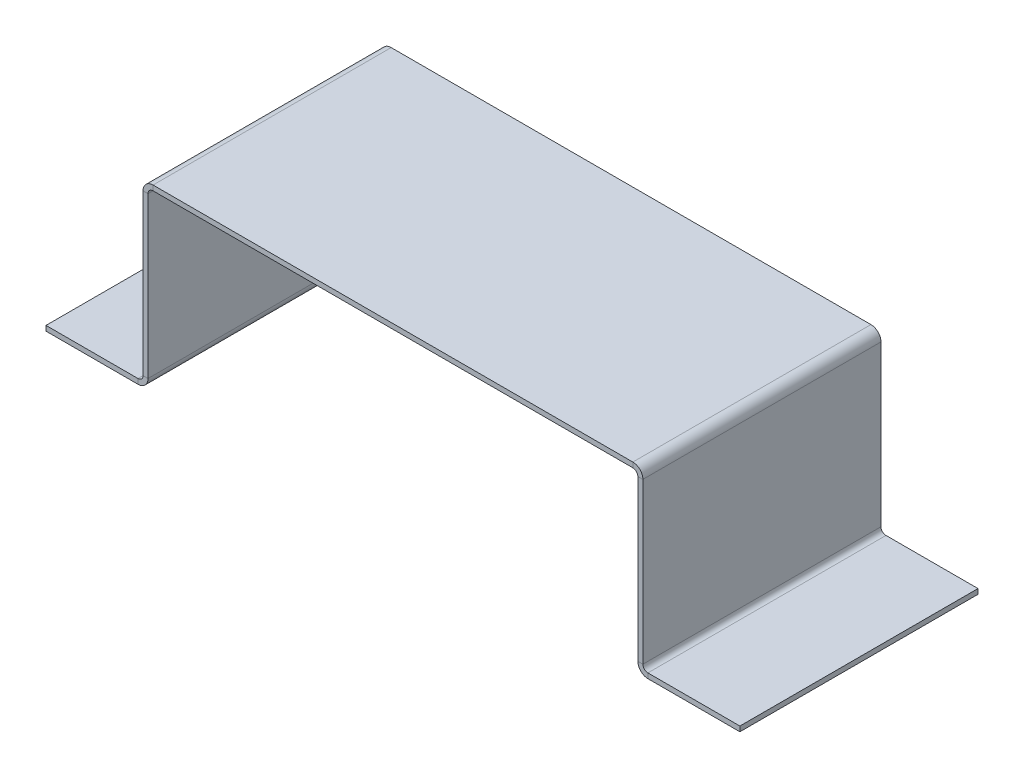
ISO-10303-21;
HEADER;
FILE_DESCRIPTION(('STEP AP214'),'2;1');
FILE_NAME('part.step','',(''),(''),'','','');
FILE_SCHEMA(('AUTOMOTIVE_DESIGN { 1 0 10303 214 1 1 1 1 }'));
ENDSEC;
DATA;
#1=APPLICATION_CONTEXT('core data for automotive mechanical design processes');
#2=APPLICATION_PROTOCOL_DEFINITION('international standard','automotive_design',2000,#1);
#3=PRODUCT_CONTEXT('',#1,'mechanical');
#4=PRODUCT('Part','Part','',(#3));
#5=PRODUCT_RELATED_PRODUCT_CATEGORY('part','',(#4));
#6=PRODUCT_DEFINITION_FORMATION('','',#4);
#7=PRODUCT_DEFINITION_CONTEXT('part definition',#1,'design');
#8=PRODUCT_DEFINITION('design','',#6,#7);
#9=PRODUCT_DEFINITION_SHAPE('','',#8);
#10=(LENGTH_UNIT() NAMED_UNIT(*) SI_UNIT(.MILLI.,.METRE.));
#11=(NAMED_UNIT(*) PLANE_ANGLE_UNIT() SI_UNIT($,.RADIAN.));
#12=(NAMED_UNIT(*) SI_UNIT($,.STERADIAN.) SOLID_ANGLE_UNIT());
#13=UNCERTAINTY_MEASURE_WITH_UNIT(LENGTH_MEASURE(1.E-05),#10,'distance_accuracy_value','');
#14=(GEOMETRIC_REPRESENTATION_CONTEXT(3) GLOBAL_UNCERTAINTY_ASSIGNED_CONTEXT((#13)) GLOBAL_UNIT_ASSIGNED_CONTEXT((#10,
#11,#12)) REPRESENTATION_CONTEXT('',''));
#15=CARTESIAN_POINT('',(0.,0.,0.));
#16=DIRECTION('',(0.,0.,1.));
#17=DIRECTION('',(1.,0.,0.));
#18=AXIS2_PLACEMENT_3D('',#15,#16,#17);
#19=CARTESIAN_POINT('',(36.7366000000001,-25.7366,17.5));
#20=DIRECTION('',(0.,0.,-1.));
#21=DIRECTION('',(-1.,0.,0.));
#22=AXIS2_PLACEMENT_3D('',#19,#20,#21);
#23=PLANE('',#22);
#24=DIRECTION('',(-1.,0.,0.));
#25=VECTOR('',#24,1.);
#26=CARTESIAN_POINT('',(36.7366000000001,-25.,17.5));
#27=LINE('',#26,#25);
#28=CARTESIAN_POINT('',(36.7366000000001,-25.,17.5));
#29=VERTEX_POINT('',#28);
#30=CARTESIAN_POINT('',(36.0000000000001,-25.,17.5));
#31=VERTEX_POINT('',#30);
#32=EDGE_CURVE('E231',#29,#31,#27,.T.);
#33=ORIENTED_EDGE('',*,*,#32,.F.);
#34=DIRECTION('',(0.,-1.,0.));
#35=VECTOR('',#34,1.);
#36=CARTESIAN_POINT('',(36.7366000000001,-25.7366,17.5));
#37=LINE('',#36,#35);
#38=CARTESIAN_POINT('',(36.7366,-1.47319999999999,17.5));
#39=VERTEX_POINT('',#38);
#40=EDGE_CURVE('E340',#39,#29,#37,.T.);
#41=ORIENTED_EDGE('',*,*,#40,.F.);
#42=DIRECTION('',(1.,0.,0.));
#43=VECTOR('',#42,1.);
#44=CARTESIAN_POINT('',(36.,-1.47319999999999,17.5));
#45=LINE('',#44,#43);
#46=CARTESIAN_POINT('',(36.,-1.47319999999999,17.5));
#47=VERTEX_POINT('',#46);
#48=EDGE_CURVE('E331',#47,#39,#45,.T.);
#49=ORIENTED_EDGE('',*,*,#48,.F.);
#50=DIRECTION('',(0.,-1.,0.));
#51=VECTOR('',#50,1.);
#52=CARTESIAN_POINT('',(36.0000000000001,-25.7366,17.5));
#53=LINE('',#52,#51);
#54=EDGE_CURVE('E339',#47,#31,#53,.T.);
#55=ORIENTED_EDGE('',*,*,#54,.T.);
#56=EDGE_LOOP('',(#33,#41,#49,#55));
#57=FACE_BOUND('',#56,.T.);
#58=ADVANCED_FACE('F37',(#57),#23,.F.);
#59=CARTESIAN_POINT('',(36.7366,-0.736599999999997,-17.5));
#60=DIRECTION('',(0.,0.,1.));
#61=DIRECTION('',(1.,0.,0.));
#62=AXIS2_PLACEMENT_3D('',#59,#60,#61);
#63=PLANE('',#62);
#64=DIRECTION('',(-1.,0.,0.));
#65=VECTOR('',#64,1.);
#66=CARTESIAN_POINT('',(36.7366000000001,-25.,-17.5));
#67=LINE('',#66,#65);
#68=CARTESIAN_POINT('',(36.7366000000001,-25.,-17.5));
#69=VERTEX_POINT('',#68);
#70=CARTESIAN_POINT('',(36.0000000000001,-25.,-17.5));
#71=VERTEX_POINT('',#70);
#72=EDGE_CURVE('E224',#69,#71,#67,.T.);
#73=ORIENTED_EDGE('',*,*,#72,.T.);
#74=DIRECTION('',(0.,1.,0.));
#75=VECTOR('',#74,1.);
#76=CARTESIAN_POINT('',(36.,-0.7366,-17.5));
#77=LINE('',#76,#75);
#78=CARTESIAN_POINT('',(36.,-1.47319999999999,-17.5));
#79=VERTEX_POINT('',#78);
#80=EDGE_CURVE('E344',#71,#79,#77,.T.);
#81=ORIENTED_EDGE('',*,*,#80,.T.);
#82=DIRECTION('',(1.,0.,0.));
#83=VECTOR('',#82,1.);
#84=CARTESIAN_POINT('',(36.,-1.47319999999999,-17.5));
#85=LINE('',#84,#83);
#86=CARTESIAN_POINT('',(36.7366,-1.47319999999999,-17.5));
#87=VERTEX_POINT('',#86);
#88=EDGE_CURVE('E326',#79,#87,#85,.T.);
#89=ORIENTED_EDGE('',*,*,#88,.T.);
#90=DIRECTION('',(0.,1.,0.));
#91=VECTOR('',#90,1.);
#92=CARTESIAN_POINT('',(36.7366,-0.736599999999997,-17.5));
#93=LINE('',#92,#91);
#94=EDGE_CURVE('E343',#69,#87,#93,.T.);
#95=ORIENTED_EDGE('',*,*,#94,.F.);
#96=EDGE_LOOP('',(#73,#81,#89,#95));
#97=FACE_BOUND('',#96,.T.);
#98=ADVANCED_FACE('F408',(#97),#63,.F.);
#99=CARTESIAN_POINT('',(36.7366,1.32467919035335E-13,0.));
#100=DIRECTION('',(-1.,0.,0.));
#101=DIRECTION('',(0.,-1.,0.));
#102=AXIS2_PLACEMENT_3D('',#99,#100,#101);
#103=PLANE('',#102);
#104=DIRECTION('',(0.,0.,-1.));
#105=VECTOR('',#104,1.);
#106=CARTESIAN_POINT('',(36.7366000000001,-25.,-17.5));
#107=LINE('',#106,#105);
#108=EDGE_CURVE('E228',#69,#29,#107,.F.);
#109=ORIENTED_EDGE('',*,*,#108,.F.);
#110=ORIENTED_EDGE('',*,*,#94,.T.);
#111=DIRECTION('',(0.,0.,-1.));
#112=VECTOR('',#111,1.);
#113=CARTESIAN_POINT('',(36.7366,-1.47319999999999,0.));
#114=LINE('',#113,#112);
#115=EDGE_CURVE('E334',#39,#87,#114,.T.);
#116=ORIENTED_EDGE('',*,*,#115,.F.);
#117=ORIENTED_EDGE('',*,*,#40,.T.);
#118=EDGE_LOOP('',(#109,#110,#116,#117));
#119=FACE_BOUND('',#118,.T.);
#120=ADVANCED_FACE('F395',(#119),#103,.F.);
#121=CARTESIAN_POINT('',(36.,1.29896093881143E-13,0.));
#122=DIRECTION('',(-1.,0.,0.));
#123=DIRECTION('',(0.,-1.,0.));
#124=AXIS2_PLACEMENT_3D('',#121,#122,#123);
#125=PLANE('',#124);
#126=ORIENTED_EDGE('',*,*,#80,.F.);
#127=DIRECTION('',(0.,0.,-1.));
#128=VECTOR('',#127,1.);
#129=CARTESIAN_POINT('',(36.0000000000001,-25.,-17.5));
#130=LINE('',#129,#128);
#131=EDGE_CURVE('E179',#71,#31,#130,.F.);
#132=ORIENTED_EDGE('',*,*,#131,.T.);
#133=ORIENTED_EDGE('',*,*,#54,.F.);
#134=DIRECTION('',(0.,0.,1.));
#135=VECTOR('',#134,1.);
#136=CARTESIAN_POINT('',(36.,-1.47319999999999,-17.5));
#137=LINE('',#136,#135);
#138=EDGE_CURVE('E329',#79,#47,#137,.T.);
#139=ORIENTED_EDGE('',*,*,#138,.F.);
#140=EDGE_LOOP('',(#126,#132,#133,#139));
#141=FACE_BOUND('',#140,.T.);
#142=ADVANCED_FACE('F404',(#141),#125,.T.);
#143=CARTESIAN_POINT('',(-36.7366000000001,-25.7366,-17.5));
#144=DIRECTION('',(0.,0.,1.));
#145=DIRECTION('',(1.,0.,0.));
#146=AXIS2_PLACEMENT_3D('',#143,#144,#145);
#147=PLANE('',#146);
#148=DIRECTION('',(1.,0.,0.));
#149=VECTOR('',#148,1.);
#150=CARTESIAN_POINT('',(-36.7366000000001,-25.,-17.5));
#151=LINE('',#150,#149);
#152=CARTESIAN_POINT('',(-36.7366000000001,-25.,-17.5));
#153=VERTEX_POINT('',#152);
#154=CARTESIAN_POINT('',(-36.0000000000001,-25.,-17.5));
#155=VERTEX_POINT('',#154);
#156=EDGE_CURVE('E280',#153,#155,#151,.T.);
#157=ORIENTED_EDGE('',*,*,#156,.F.);
#158=DIRECTION('',(0.,-1.,0.));
#159=VECTOR('',#158,1.);
#160=CARTESIAN_POINT('',(-36.7366000000001,-25.7366,-17.5));
#161=LINE('',#160,#159);
#162=CARTESIAN_POINT('',(-36.7366,-1.47319999999999,-17.5));
#163=VERTEX_POINT('',#162);
#164=EDGE_CURVE('E296',#163,#153,#161,.T.);
#165=ORIENTED_EDGE('',*,*,#164,.F.);
#166=DIRECTION('',(-1.,0.,0.));
#167=VECTOR('',#166,1.);
#168=CARTESIAN_POINT('',(-36.,-1.47319999999999,-17.5));
#169=LINE('',#168,#167);
#170=CARTESIAN_POINT('',(-36.,-1.47319999999999,-17.5));
#171=VERTEX_POINT('',#170);
#172=EDGE_CURVE('E287',#171,#163,#169,.T.);
#173=ORIENTED_EDGE('',*,*,#172,.F.);
#174=DIRECTION('',(0.,-1.,0.));
#175=VECTOR('',#174,1.);
#176=CARTESIAN_POINT('',(-36.0000000000001,-25.7366,-17.5));
#177=LINE('',#176,#175);
#178=EDGE_CURVE('E295',#171,#155,#177,.T.);
#179=ORIENTED_EDGE('',*,*,#178,.T.);
#180=EDGE_LOOP('',(#157,#165,#173,#179));
#181=FACE_BOUND('',#180,.T.);
#182=ADVANCED_FACE('F435',(#181),#147,.F.);
#183=CARTESIAN_POINT('',(-36.7366,-0.736599999999997,17.5));
#184=DIRECTION('',(0.,0.,-1.));
#185=DIRECTION('',(-1.,0.,0.));
#186=AXIS2_PLACEMENT_3D('',#183,#184,#185);
#187=PLANE('',#186);
#188=DIRECTION('',(1.,0.,0.));
#189=VECTOR('',#188,1.);
#190=CARTESIAN_POINT('',(-36.7366000000001,-25.,17.5));
#191=LINE('',#190,#189);
#192=CARTESIAN_POINT('',(-36.7366000000001,-25.,17.5));
#193=VERTEX_POINT('',#192);
#194=CARTESIAN_POINT('',(-36.0000000000001,-25.,17.5));
#195=VERTEX_POINT('',#194);
#196=EDGE_CURVE('E270',#193,#195,#191,.T.);
#197=ORIENTED_EDGE('',*,*,#196,.T.);
#198=DIRECTION('',(0.,1.,0.));
#199=VECTOR('',#198,1.);
#200=CARTESIAN_POINT('',(-36.,-0.7366,17.5));
#201=LINE('',#200,#199);
#202=CARTESIAN_POINT('',(-36.,-1.47319999999999,17.5));
#203=VERTEX_POINT('',#202);
#204=EDGE_CURVE('E300',#195,#203,#201,.T.);
#205=ORIENTED_EDGE('',*,*,#204,.T.);
#206=DIRECTION('',(-1.,0.,0.));
#207=VECTOR('',#206,1.);
#208=CARTESIAN_POINT('',(-36.,-1.47319999999999,17.5));
#209=LINE('',#208,#207);
#210=CARTESIAN_POINT('',(-36.7366,-1.47319999999999,17.5));
#211=VERTEX_POINT('',#210);
#212=EDGE_CURVE('E282',#203,#211,#209,.T.);
#213=ORIENTED_EDGE('',*,*,#212,.T.);
#214=DIRECTION('',(0.,1.,0.));
#215=VECTOR('',#214,1.);
#216=CARTESIAN_POINT('',(-36.7366,-0.736599999999997,17.5));
#217=LINE('',#216,#215);
#218=EDGE_CURVE('E299',#193,#211,#217,.T.);
#219=ORIENTED_EDGE('',*,*,#218,.F.);
#220=EDGE_LOOP('',(#197,#205,#213,#219));
#221=FACE_BOUND('',#220,.T.);
#222=ADVANCED_FACE('F449',(#221),#187,.F.);
#223=CARTESIAN_POINT('',(-36.7366,1.32467919035335E-13,0.));
#224=DIRECTION('',(1.,0.,0.));
#225=DIRECTION('',(0.,1.,0.));
#226=AXIS2_PLACEMENT_3D('',#223,#224,#225);
#227=PLANE('',#226);
#228=DIRECTION('',(0.,0.,1.));
#229=VECTOR('',#228,1.);
#230=CARTESIAN_POINT('',(-36.7366000000001,-25.,17.5));
#231=LINE('',#230,#229);
#232=EDGE_CURVE('E276',#193,#153,#231,.F.);
#233=ORIENTED_EDGE('',*,*,#232,.F.);
#234=ORIENTED_EDGE('',*,*,#218,.T.);
#235=DIRECTION('',(0.,0.,1.));
#236=VECTOR('',#235,1.);
#237=CARTESIAN_POINT('',(-36.7366,-1.47319999999999,0.));
#238=LINE('',#237,#236);
#239=EDGE_CURVE('E290',#163,#211,#238,.T.);
#240=ORIENTED_EDGE('',*,*,#239,.F.);
#241=ORIENTED_EDGE('',*,*,#164,.T.);
#242=EDGE_LOOP('',(#233,#234,#240,#241));
#243=FACE_BOUND('',#242,.T.);
#244=ADVANCED_FACE('F440',(#243),#227,.F.);
#245=CARTESIAN_POINT('',(-36.,1.29896093881143E-13,0.));
#246=DIRECTION('',(1.,0.,0.));
#247=DIRECTION('',(0.,1.,0.));
#248=AXIS2_PLACEMENT_3D('',#245,#246,#247);
#249=PLANE('',#248);
#250=ORIENTED_EDGE('',*,*,#204,.F.);
#251=DIRECTION('',(0.,0.,1.));
#252=VECTOR('',#251,1.);
#253=CARTESIAN_POINT('',(-36.0000000000001,-25.,17.5));
#254=LINE('',#253,#252);
#255=EDGE_CURVE('E265',#195,#155,#254,.F.);
#256=ORIENTED_EDGE('',*,*,#255,.T.);
#257=ORIENTED_EDGE('',*,*,#178,.F.);
#258=DIRECTION('',(0.,0.,-1.));
#259=VECTOR('',#258,1.);
#260=CARTESIAN_POINT('',(-36.,-1.47319999999999,17.5));
#261=LINE('',#260,#259);
#262=EDGE_CURVE('E285',#203,#171,#261,.T.);
#263=ORIENTED_EDGE('',*,*,#262,.F.);
#264=EDGE_LOOP('',(#250,#256,#257,#263));
#265=FACE_BOUND('',#264,.T.);
#266=ADVANCED_FACE('F432',(#265),#249,.T.);
#267=CARTESIAN_POINT('',(0.,-0.7366,0.));
#268=DIRECTION('',(0.,-1.,0.));
#269=DIRECTION('',(0.,0.,-1.));
#270=AXIS2_PLACEMENT_3D('',#267,#268,#269);
#271=PLANE('',#270);
#272=DIRECTION('',(1.,0.,0.));
#273=VECTOR('',#272,1.);
#274=CARTESIAN_POINT('',(-36.,-0.7366,17.5));
#275=LINE('',#274,#273);
#276=CARTESIAN_POINT('',(-35.2634,-0.736600000000007,17.5));
#277=VERTEX_POINT('',#276);
#278=CARTESIAN_POINT('',(35.2634,-0.7366,17.5));
#279=VERTEX_POINT('',#278);
#280=EDGE_CURVE('E11',#277,#279,#275,.T.);
#281=ORIENTED_EDGE('',*,*,#280,.F.);
#282=DIRECTION('',(0.,0.,-1.));
#283=VECTOR('',#282,1.);
#284=CARTESIAN_POINT('',(-35.2634,-0.736600000000007,-17.5));
#285=LINE('',#284,#283);
#286=CARTESIAN_POINT('',(-35.2634,-0.736600000000007,-17.5));
#287=VERTEX_POINT('',#286);
#288=EDGE_CURVE('E318',#287,#277,#285,.F.);
#289=ORIENTED_EDGE('',*,*,#288,.F.);
#290=DIRECTION('',(-1.,0.,0.));
#291=VECTOR('',#290,1.);
#292=CARTESIAN_POINT('',(-36.,-0.7366,-17.5));
#293=LINE('',#292,#291);
#294=CARTESIAN_POINT('',(35.2634,-0.7366,-17.5));
#295=VERTEX_POINT('',#294);
#296=EDGE_CURVE('E46',#295,#287,#293,.T.);
#297=ORIENTED_EDGE('',*,*,#296,.F.);
#298=DIRECTION('',(0.,0.,1.));
#299=VECTOR('',#298,1.);
#300=CARTESIAN_POINT('',(35.2634,-0.736600000000007,17.5));
#301=LINE('',#300,#299);
#302=EDGE_CURVE('E362',#279,#295,#301,.F.);
#303=ORIENTED_EDGE('',*,*,#302,.F.);
#304=EDGE_LOOP('',(#281,#289,#297,#303));
#305=FACE_BOUND('',#304,.T.);
#306=ADVANCED_FACE('F418',(#305),#271,.T.);
#307=CARTESIAN_POINT('',(0.,0.,0.));
#308=DIRECTION('',(0.,-1.,0.));
#309=DIRECTION('',(0.,0.,-1.));
#310=AXIS2_PLACEMENT_3D('',#307,#308,#309);
#311=PLANE('',#310);
#312=DIRECTION('',(0.,0.,-1.));
#313=VECTOR('',#312,1.);
#314=CARTESIAN_POINT('',(-35.2634,0.,-17.5));
#315=LINE('',#314,#313);
#316=CARTESIAN_POINT('',(-35.2634,0.,-17.5));
#317=VERTEX_POINT('',#316);
#318=CARTESIAN_POINT('',(-35.2634,0.,17.5));
#319=VERTEX_POINT('',#318);
#320=EDGE_CURVE('E306',#317,#319,#315,.F.);
#321=ORIENTED_EDGE('',*,*,#320,.T.);
#322=DIRECTION('',(1.,0.,0.));
#323=VECTOR('',#322,1.);
#324=CARTESIAN_POINT('',(-36.,0.,17.5));
#325=LINE('',#324,#323);
#326=CARTESIAN_POINT('',(35.2634,0.,17.5));
#327=VERTEX_POINT('',#326);
#328=EDGE_CURVE('E41',#319,#327,#325,.T.);
#329=ORIENTED_EDGE('',*,*,#328,.T.);
#330=DIRECTION('',(0.,0.,1.));
#331=VECTOR('',#330,1.);
#332=CARTESIAN_POINT('',(35.2634,0.,17.5));
#333=LINE('',#332,#331);
#334=CARTESIAN_POINT('',(35.2634,0.,-17.5));
#335=VERTEX_POINT('',#334);
#336=EDGE_CURVE('E350',#327,#335,#333,.F.);
#337=ORIENTED_EDGE('',*,*,#336,.T.);
#338=DIRECTION('',(-1.,0.,0.));
#339=VECTOR('',#338,1.);
#340=CARTESIAN_POINT('',(-36.,0.,-17.5));
#341=LINE('',#340,#339);
#342=EDGE_CURVE('E370',#335,#317,#341,.T.);
#343=ORIENTED_EDGE('',*,*,#342,.T.);
#344=EDGE_LOOP('',(#321,#329,#337,#343));
#345=FACE_BOUND('',#344,.T.);
#346=ADVANCED_FACE('F378',(#345),#311,.F.);
#347=CARTESIAN_POINT('',(-36.,-0.7366,-17.5));
#348=DIRECTION('',(0.,0.,-1.));
#349=DIRECTION('',(-1.,0.,0.));
#350=AXIS2_PLACEMENT_3D('',#347,#348,#349);
#351=PLANE('',#350);
#352=ORIENTED_EDGE('',*,*,#296,.T.);
#353=DIRECTION('',(0.,1.,0.));
#354=VECTOR('',#353,1.);
#355=CARTESIAN_POINT('',(-35.2634,-0.736600000000007,-17.5));
#356=LINE('',#355,#354);
#357=EDGE_CURVE('E312',#287,#317,#356,.T.);
#358=ORIENTED_EDGE('',*,*,#357,.T.);
#359=ORIENTED_EDGE('',*,*,#342,.F.);
#360=DIRECTION('',(0.,1.,0.));
#361=VECTOR('',#360,1.);
#362=CARTESIAN_POINT('',(35.2634,-0.736600000000007,-17.5));
#363=LINE('',#362,#361);
#364=EDGE_CURVE('E367',#295,#335,#363,.T.);
#365=ORIENTED_EDGE('',*,*,#364,.F.);
#366=EDGE_LOOP('',(#352,#358,#359,#365));
#367=FACE_BOUND('',#366,.T.);
#368=ADVANCED_FACE('F39',(#367),#351,.T.);
#369=CARTESIAN_POINT('',(-36.,-0.7366,17.5));
#370=DIRECTION('',(0.,0.,1.));
#371=DIRECTION('',(1.,0.,0.));
#372=AXIS2_PLACEMENT_3D('',#369,#370,#371);
#373=PLANE('',#372);
#374=DIRECTION('',(0.,1.,0.));
#375=VECTOR('',#374,1.);
#376=CARTESIAN_POINT('',(-35.2634,-0.736600000000007,17.5));
#377=LINE('',#376,#375);
#378=EDGE_CURVE('E323',#277,#319,#377,.T.);
#379=ORIENTED_EDGE('',*,*,#378,.F.);
#380=ORIENTED_EDGE('',*,*,#280,.T.);
#381=DIRECTION('',(0.,1.,0.));
#382=VECTOR('',#381,1.);
#383=CARTESIAN_POINT('',(35.2634,-0.736600000000007,17.5));
#384=LINE('',#383,#382);
#385=EDGE_CURVE('E356',#279,#327,#384,.T.);
#386=ORIENTED_EDGE('',*,*,#385,.T.);
#387=ORIENTED_EDGE('',*,*,#328,.F.);
#388=EDGE_LOOP('',(#379,#380,#386,#387));
#389=FACE_BOUND('',#388,.T.);
#390=ADVANCED_FACE('F503',(#389),#373,.T.);
#391=CARTESIAN_POINT('',(35.2634,-1.4732,-17.5));
#392=DIRECTION('',(0.,0.,-1.));
#393=DIRECTION('',(-1.,0.,0.));
#394=AXIS2_PLACEMENT_3D('',#391,#392,#393);
#395=PLANE('',#394);
#396=ORIENTED_EDGE('',*,*,#88,.F.);
#397=CARTESIAN_POINT('',(35.2634,-1.4732,-17.5));
#398=DIRECTION('',(0.,0.,1.));
#399=DIRECTION('',(1.,0.,0.));
#400=AXIS2_PLACEMENT_3D('',#397,#398,#399);
#401=CIRCLE('',#400,0.73659999999999);
#402=EDGE_CURVE('E359',#295,#79,#401,.F.);
#403=ORIENTED_EDGE('',*,*,#402,.F.);
#404=ORIENTED_EDGE('',*,*,#364,.T.);
#405=CARTESIAN_POINT('',(35.2634,-1.4732,-17.5));
#406=DIRECTION('',(0.,0.,1.));
#407=DIRECTION('',(1.,0.,0.));
#408=AXIS2_PLACEMENT_3D('',#405,#406,#407);
#409=CIRCLE('',#408,1.47319999999999);
#410=EDGE_CURVE('E352',#335,#87,#409,.F.);
#411=ORIENTED_EDGE('',*,*,#410,.T.);
#412=EDGE_LOOP('',(#396,#403,#404,#411));
#413=FACE_BOUND('',#412,.T.);
#414=ADVANCED_FACE('F411',(#413),#395,.T.);
#415=CARTESIAN_POINT('',(35.2634,-1.4732,17.5));
#416=DIRECTION('',(0.,0.,-1.));
#417=DIRECTION('',(-1.,0.,0.));
#418=AXIS2_PLACEMENT_3D('',#415,#416,#417);
#419=PLANE('',#418);
#420=CARTESIAN_POINT('',(35.2634,-1.4732,17.5));
#421=DIRECTION('',(0.,0.,1.));
#422=DIRECTION('',(1.,0.,0.));
#423=AXIS2_PLACEMENT_3D('',#420,#421,#422);
#424=CIRCLE('',#423,0.73659999999999);
#425=EDGE_CURVE('E346',#47,#279,#424,.T.);
#426=ORIENTED_EDGE('',*,*,#425,.F.);
#427=ORIENTED_EDGE('',*,*,#48,.T.);
#428=CARTESIAN_POINT('',(35.2634,-1.4732,17.5));
#429=DIRECTION('',(0.,0.,1.));
#430=DIRECTION('',(1.,0.,0.));
#431=AXIS2_PLACEMENT_3D('',#428,#429,#430);
#432=CIRCLE('',#431,1.47319999999999);
#433=EDGE_CURVE('E353',#39,#327,#432,.T.);
#434=ORIENTED_EDGE('',*,*,#433,.T.);
#435=ORIENTED_EDGE('',*,*,#385,.F.);
#436=EDGE_LOOP('',(#426,#427,#434,#435));
#437=FACE_BOUND('',#436,.T.);
#438=ADVANCED_FACE('F387',(#437),#419,.F.);
#439=CARTESIAN_POINT('',(35.2634,-1.4732,17.5));
#440=DIRECTION('',(0.,0.,1.));
#441=DIRECTION('',(1.,0.,0.));
#442=AXIS2_PLACEMENT_3D('',#439,#440,#441);
#443=CYLINDRICAL_SURFACE('',#442,1.47319999999999);
#444=ORIENTED_EDGE('',*,*,#336,.F.);
#445=ORIENTED_EDGE('',*,*,#433,.F.);
#446=ORIENTED_EDGE('',*,*,#115,.T.);
#447=ORIENTED_EDGE('',*,*,#410,.F.);
#448=EDGE_LOOP('',(#444,#445,#446,#447));
#449=FACE_BOUND('',#448,.T.);
#450=ADVANCED_FACE('F383',(#449),#443,.T.);
#451=CARTESIAN_POINT('',(35.2634,-1.4732,17.5));
#452=DIRECTION('',(0.,0.,1.));
#453=DIRECTION('',(1.,0.,0.));
#454=AXIS2_PLACEMENT_3D('',#451,#452,#453);
#455=CYLINDRICAL_SURFACE('',#454,0.73659999999999);
#456=ORIENTED_EDGE('',*,*,#302,.T.);
#457=ORIENTED_EDGE('',*,*,#402,.T.);
#458=ORIENTED_EDGE('',*,*,#138,.T.);
#459=ORIENTED_EDGE('',*,*,#425,.T.);
#460=EDGE_LOOP('',(#456,#457,#458,#459));
#461=FACE_BOUND('',#460,.T.);
#462=ADVANCED_FACE('F413',(#461),#455,.F.);
#463=CARTESIAN_POINT('',(-35.2634,-1.4732,17.5));
#464=DIRECTION('',(0.,0.,1.));
#465=DIRECTION('',(1.,0.,0.));
#466=AXIS2_PLACEMENT_3D('',#463,#464,#465);
#467=PLANE('',#466);
#468=ORIENTED_EDGE('',*,*,#212,.F.);
#469=CARTESIAN_POINT('',(-35.2634,-1.4732,17.5));
#470=DIRECTION('',(0.,0.,-1.));
#471=DIRECTION('',(-1.,0.,0.));
#472=AXIS2_PLACEMENT_3D('',#469,#470,#471);
#473=CIRCLE('',#472,0.73659999999999);
#474=EDGE_CURVE('E315',#277,#203,#473,.F.);
#475=ORIENTED_EDGE('',*,*,#474,.F.);
#476=ORIENTED_EDGE('',*,*,#378,.T.);
#477=CARTESIAN_POINT('',(-35.2634,-1.4732,17.5));
#478=DIRECTION('',(0.,0.,-1.));
#479=DIRECTION('',(-1.,0.,0.));
#480=AXIS2_PLACEMENT_3D('',#477,#478,#479);
#481=CIRCLE('',#480,1.47319999999999);
#482=EDGE_CURVE('E308',#319,#211,#481,.F.);
#483=ORIENTED_EDGE('',*,*,#482,.T.);
#484=EDGE_LOOP('',(#468,#475,#476,#483));
#485=FACE_BOUND('',#484,.T.);
#486=ADVANCED_FACE('F447',(#485),#467,.T.);
#487=CARTESIAN_POINT('',(-35.2634,-1.4732,-17.5));
#488=DIRECTION('',(0.,0.,1.));
#489=DIRECTION('',(1.,0.,0.));
#490=AXIS2_PLACEMENT_3D('',#487,#488,#489);
#491=PLANE('',#490);
#492=CARTESIAN_POINT('',(-35.2634,-1.4732,-17.5));
#493=DIRECTION('',(0.,0.,-1.));
#494=DIRECTION('',(-1.,0.,0.));
#495=AXIS2_PLACEMENT_3D('',#492,#493,#494);
#496=CIRCLE('',#495,0.73659999999999);
#497=EDGE_CURVE('E302',#171,#287,#496,.T.);
#498=ORIENTED_EDGE('',*,*,#497,.F.);
#499=ORIENTED_EDGE('',*,*,#172,.T.);
#500=CARTESIAN_POINT('',(-35.2634,-1.4732,-17.5));
#501=DIRECTION('',(0.,0.,-1.));
#502=DIRECTION('',(-1.,0.,0.));
#503=AXIS2_PLACEMENT_3D('',#500,#501,#502);
#504=CIRCLE('',#503,1.47319999999999);
#505=EDGE_CURVE('E309',#163,#317,#504,.T.);
#506=ORIENTED_EDGE('',*,*,#505,.T.);
#507=ORIENTED_EDGE('',*,*,#357,.F.);
#508=EDGE_LOOP('',(#498,#499,#506,#507));
#509=FACE_BOUND('',#508,.T.);
#510=ADVANCED_FACE('F423',(#509),#491,.F.);
#511=CARTESIAN_POINT('',(-35.2634,-1.4732,-17.5));
#512=DIRECTION('',(0.,0.,-1.));
#513=DIRECTION('',(-1.,0.,0.));
#514=AXIS2_PLACEMENT_3D('',#511,#512,#513);
#515=CYLINDRICAL_SURFACE('',#514,1.47319999999999);
#516=ORIENTED_EDGE('',*,*,#320,.F.);
#517=ORIENTED_EDGE('',*,*,#505,.F.);
#518=ORIENTED_EDGE('',*,*,#239,.T.);
#519=ORIENTED_EDGE('',*,*,#482,.F.);
#520=EDGE_LOOP('',(#516,#517,#518,#519));
#521=FACE_BOUND('',#520,.T.);
#522=ADVANCED_FACE('F444',(#521),#515,.T.);
#523=CARTESIAN_POINT('',(-35.2634,-1.4732,-17.5));
#524=DIRECTION('',(0.,0.,-1.));
#525=DIRECTION('',(-1.,0.,0.));
#526=AXIS2_PLACEMENT_3D('',#523,#524,#525);
#527=CYLINDRICAL_SURFACE('',#526,0.73659999999999);
#528=ORIENTED_EDGE('',*,*,#288,.T.);
#529=ORIENTED_EDGE('',*,*,#474,.T.);
#530=ORIENTED_EDGE('',*,*,#262,.T.);
#531=ORIENTED_EDGE('',*,*,#497,.T.);
#532=EDGE_LOOP('',(#528,#529,#530,#531));
#533=FACE_BOUND('',#532,.T.);
#534=ADVANCED_FACE('F426',(#533),#527,.F.);
#535=CARTESIAN_POINT('',(-37.4732000000001,-25.,-17.5));
#536=DIRECTION('',(0.,0.,-1.));
#537=DIRECTION('',(-1.,0.,0.));
#538=AXIS2_PLACEMENT_3D('',#535,#536,#537);
#539=PLANE('',#538);
#540=DIRECTION('',(0.,-1.,0.));
#541=VECTOR('',#540,1.);
#542=CARTESIAN_POINT('',(-37.4732000000001,-25.7366,-17.5));
#543=LINE('',#542,#541);
#544=CARTESIAN_POINT('',(-37.4732000000001,-25.7366,-17.5));
#545=VERTEX_POINT('',#544);
#546=CARTESIAN_POINT('',(-37.4732000000001,-26.4732,-17.5));
#547=VERTEX_POINT('',#546);
#548=EDGE_CURVE('E233',#545,#547,#543,.T.);
#549=ORIENTED_EDGE('',*,*,#548,.F.);
#550=CARTESIAN_POINT('',(-37.4732000000001,-25.,-17.5));
#551=DIRECTION('',(0.,0.,1.));
#552=DIRECTION('',(1.,0.,0.));
#553=AXIS2_PLACEMENT_3D('',#550,#551,#552);
#554=CIRCLE('',#553,0.7366);
#555=EDGE_CURVE('E273',#153,#545,#554,.F.);
#556=ORIENTED_EDGE('',*,*,#555,.F.);
#557=ORIENTED_EDGE('',*,*,#156,.T.);
#558=CARTESIAN_POINT('',(-37.4732000000001,-25.,-17.5));
#559=DIRECTION('',(0.,0.,1.));
#560=DIRECTION('',(1.,0.,0.));
#561=AXIS2_PLACEMENT_3D('',#558,#559,#560);
#562=CIRCLE('',#561,1.4732);
#563=EDGE_CURVE('E62',#155,#547,#562,.F.);
#564=ORIENTED_EDGE('',*,*,#563,.T.);
#565=EDGE_LOOP('',(#549,#556,#557,#564));
#566=FACE_BOUND('',#565,.T.);
#567=ADVANCED_FACE('F479',(#566),#539,.T.);
#568=CARTESIAN_POINT('',(-37.4732000000001,-25.,17.5));
#569=DIRECTION('',(0.,0.,-1.));
#570=DIRECTION('',(-1.,0.,0.));
#571=AXIS2_PLACEMENT_3D('',#568,#569,#570);
#572=PLANE('',#571);
#573=CARTESIAN_POINT('',(-37.4732000000001,-25.,17.5));
#574=DIRECTION('',(0.,0.,1.));
#575=DIRECTION('',(1.,0.,0.));
#576=AXIS2_PLACEMENT_3D('',#573,#574,#575);
#577=CIRCLE('',#576,0.7366);
#578=CARTESIAN_POINT('',(-37.4732000000001,-25.7366,17.5));
#579=VERTEX_POINT('',#578);
#580=EDGE_CURVE('E264',#579,#193,#577,.T.);
#581=ORIENTED_EDGE('',*,*,#580,.F.);
#582=DIRECTION('',(0.,-1.,0.));
#583=VECTOR('',#582,1.);
#584=CARTESIAN_POINT('',(-37.4732000000001,-25.7366,17.5));
#585=LINE('',#584,#583);
#586=CARTESIAN_POINT('',(-37.4732000000001,-26.4732,17.5));
#587=VERTEX_POINT('',#586);
#588=EDGE_CURVE('E237',#579,#587,#585,.T.);
#589=ORIENTED_EDGE('',*,*,#588,.T.);
#590=CARTESIAN_POINT('',(-37.4732000000001,-25.,17.5));
#591=DIRECTION('',(0.,0.,1.));
#592=DIRECTION('',(1.,0.,0.));
#593=AXIS2_PLACEMENT_3D('',#590,#591,#592);
#594=CIRCLE('',#593,1.4732);
#595=EDGE_CURVE('E268',#587,#195,#594,.T.);
#596=ORIENTED_EDGE('',*,*,#595,.T.);
#597=ORIENTED_EDGE('',*,*,#196,.F.);
#598=EDGE_LOOP('',(#581,#589,#596,#597));
#599=FACE_BOUND('',#598,.T.);
#600=ADVANCED_FACE('F452',(#599),#572,.F.);
#601=CARTESIAN_POINT('',(-37.4732000000001,-25.,17.5));
#602=DIRECTION('',(0.,0.,1.));
#603=DIRECTION('',(0.,-1.,0.));
#604=AXIS2_PLACEMENT_3D('',#601,#602,#603);
#605=CYLINDRICAL_SURFACE('',#604,1.4732);
#606=ORIENTED_EDGE('',*,*,#255,.F.);
#607=ORIENTED_EDGE('',*,*,#595,.F.);
#608=DIRECTION('',(0.,0.,-1.));
#609=VECTOR('',#608,1.);
#610=CARTESIAN_POINT('',(-37.4732000000001,-26.4732,0.));
#611=LINE('',#610,#609);
#612=EDGE_CURVE('E240',#587,#547,#611,.T.);
#613=ORIENTED_EDGE('',*,*,#612,.T.);
#614=ORIENTED_EDGE('',*,*,#563,.F.);
#615=EDGE_LOOP('',(#606,#607,#613,#614));
#616=FACE_BOUND('',#615,.T.);
#617=ADVANCED_FACE('F477',(#616),#605,.T.);
#618=CARTESIAN_POINT('',(-37.4732000000001,-25.,17.5));
#619=DIRECTION('',(0.,0.,1.));
#620=DIRECTION('',(0.,-1.,0.));
#621=AXIS2_PLACEMENT_3D('',#618,#619,#620);
#622=CYLINDRICAL_SURFACE('',#621,0.7366);
#623=ORIENTED_EDGE('',*,*,#232,.T.);
#624=ORIENTED_EDGE('',*,*,#555,.T.);
#625=DIRECTION('',(0.,0.,1.));
#626=VECTOR('',#625,1.);
#627=CARTESIAN_POINT('',(-37.4732000000001,-25.7366,-17.5));
#628=LINE('',#627,#626);
#629=EDGE_CURVE('E235',#545,#579,#628,.T.);
#630=ORIENTED_EDGE('',*,*,#629,.T.);
#631=ORIENTED_EDGE('',*,*,#580,.T.);
#632=EDGE_LOOP('',(#623,#624,#630,#631));
#633=FACE_BOUND('',#632,.T.);
#634=ADVANCED_FACE('F455',(#633),#622,.F.);
#635=CARTESIAN_POINT('',(-36.7366000000001,-26.4732,-17.5));
#636=DIRECTION('',(0.,0.,1.));
#637=DIRECTION('',(1.,0.,0.));
#638=AXIS2_PLACEMENT_3D('',#635,#636,#637);
#639=PLANE('',#638);
#640=ORIENTED_EDGE('',*,*,#548,.T.);
#641=DIRECTION('',(1.,0.,0.));
#642=VECTOR('',#641,1.);
#643=CARTESIAN_POINT('',(-36.7366000000001,-26.4732,-17.5));
#644=LINE('',#643,#642);
#645=CARTESIAN_POINT('',(-51.0000000000001,-26.4732,-17.5));
#646=VERTEX_POINT('',#645);
#647=EDGE_CURVE('E245',#646,#547,#644,.T.);
#648=ORIENTED_EDGE('',*,*,#647,.F.);
#649=DIRECTION('',(0.,1.,0.));
#650=VECTOR('',#649,1.);
#651=CARTESIAN_POINT('',(-51.0000000000001,-26.4732,-17.5));
#652=LINE('',#651,#650);
#653=CARTESIAN_POINT('',(-51.0000000000001,-25.7366,-17.5));
#654=VERTEX_POINT('',#653);
#655=EDGE_CURVE('E253',#646,#654,#652,.T.);
#656=ORIENTED_EDGE('',*,*,#655,.T.);
#657=DIRECTION('',(1.,0.,0.));
#658=VECTOR('',#657,1.);
#659=CARTESIAN_POINT('',(-36.7366000000001,-25.7366,-17.5));
#660=LINE('',#659,#658);
#661=EDGE_CURVE('E244',#654,#545,#660,.T.);
#662=ORIENTED_EDGE('',*,*,#661,.T.);
#663=EDGE_LOOP('',(#640,#648,#656,#662));
#664=FACE_BOUND('',#663,.T.);
#665=ADVANCED_FACE('F464',(#664),#639,.F.);
#666=CARTESIAN_POINT('',(-51.0000000000001,-26.4732,17.5));
#667=DIRECTION('',(0.,0.,-1.));
#668=DIRECTION('',(-1.,0.,0.));
#669=AXIS2_PLACEMENT_3D('',#666,#667,#668);
#670=PLANE('',#669);
#671=ORIENTED_EDGE('',*,*,#588,.F.);
#672=DIRECTION('',(-1.,0.,0.));
#673=VECTOR('',#672,1.);
#674=CARTESIAN_POINT('',(-51.0000000000001,-25.7366,17.5));
#675=LINE('',#674,#673);
#676=CARTESIAN_POINT('',(-51.0000000000001,-25.7366,17.5));
#677=VERTEX_POINT('',#676);
#678=EDGE_CURVE('E256',#579,#677,#675,.T.);
#679=ORIENTED_EDGE('',*,*,#678,.T.);
#680=DIRECTION('',(0.,1.,0.));
#681=VECTOR('',#680,1.);
#682=CARTESIAN_POINT('',(-51.0000000000001,-26.4732,17.5));
#683=LINE('',#682,#681);
#684=CARTESIAN_POINT('',(-51.0000000000001,-26.4732,17.5));
#685=VERTEX_POINT('',#684);
#686=EDGE_CURVE('E261',#685,#677,#683,.T.);
#687=ORIENTED_EDGE('',*,*,#686,.F.);
#688=DIRECTION('',(-1.,0.,0.));
#689=VECTOR('',#688,1.);
#690=CARTESIAN_POINT('',(-51.0000000000001,-26.4732,17.5));
#691=LINE('',#690,#689);
#692=EDGE_CURVE('E248',#587,#685,#691,.T.);
#693=ORIENTED_EDGE('',*,*,#692,.F.);
#694=EDGE_LOOP('',(#671,#679,#687,#693));
#695=FACE_BOUND('',#694,.T.);
#696=ADVANCED_FACE('F473',(#695),#670,.F.);
#697=CARTESIAN_POINT('',(0.,-26.4732,0.));
#698=DIRECTION('',(0.,1.,0.));
#699=DIRECTION('',(0.,0.,1.));
#700=AXIS2_PLACEMENT_3D('',#697,#698,#699);
#701=PLANE('',#700);
#702=ORIENTED_EDGE('',*,*,#612,.F.);
#703=ORIENTED_EDGE('',*,*,#692,.T.);
#704=DIRECTION('',(0.,0.,-1.));
#705=VECTOR('',#704,1.);
#706=CARTESIAN_POINT('',(-51.0000000000001,-26.4732,-17.5));
#707=LINE('',#706,#705);
#708=EDGE_CURVE('E251',#685,#646,#707,.T.);
#709=ORIENTED_EDGE('',*,*,#708,.T.);
#710=ORIENTED_EDGE('',*,*,#647,.T.);
#711=EDGE_LOOP('',(#702,#703,#709,#710));
#712=FACE_BOUND('',#711,.T.);
#713=ADVANCED_FACE('F476',(#712),#701,.F.);
#714=CARTESIAN_POINT('',(0.,-25.7366,0.));
#715=DIRECTION('',(0.,1.,0.));
#716=DIRECTION('',(0.,0.,1.));
#717=AXIS2_PLACEMENT_3D('',#714,#715,#716);
#718=PLANE('',#717);
#719=ORIENTED_EDGE('',*,*,#678,.F.);
#720=ORIENTED_EDGE('',*,*,#629,.F.);
#721=ORIENTED_EDGE('',*,*,#661,.F.);
#722=DIRECTION('',(0.,0.,-1.));
#723=VECTOR('',#722,1.);
#724=CARTESIAN_POINT('',(-51.0000000000001,-25.7366,-17.5));
#725=LINE('',#724,#723);
#726=EDGE_CURVE('E249',#677,#654,#725,.T.);
#727=ORIENTED_EDGE('',*,*,#726,.F.);
#728=EDGE_LOOP('',(#719,#720,#721,#727));
#729=FACE_BOUND('',#728,.T.);
#730=ADVANCED_FACE('F461',(#729),#718,.T.);
#731=CARTESIAN_POINT('',(-51.0000000000001,-26.4732,-17.5));
#732=DIRECTION('',(1.,0.,0.));
#733=DIRECTION('',(0.,1.,0.));
#734=AXIS2_PLACEMENT_3D('',#731,#732,#733);
#735=PLANE('',#734);
#736=ORIENTED_EDGE('',*,*,#726,.T.);
#737=ORIENTED_EDGE('',*,*,#655,.F.);
#738=ORIENTED_EDGE('',*,*,#708,.F.);
#739=ORIENTED_EDGE('',*,*,#686,.T.);
#740=EDGE_LOOP('',(#736,#737,#738,#739));
#741=FACE_BOUND('',#740,.T.);
#742=ADVANCED_FACE('F469',(#741),#735,.F.);
#743=CARTESIAN_POINT('',(37.4732000000001,-25.,17.5));
#744=DIRECTION('',(0.,0.,1.));
#745=DIRECTION('',(1.,0.,0.));
#746=AXIS2_PLACEMENT_3D('',#743,#744,#745);
#747=PLANE('',#746);
#748=DIRECTION('',(0.,-1.,0.));
#749=VECTOR('',#748,1.);
#750=CARTESIAN_POINT('',(37.4732000000001,-25.7366,17.5));
#751=LINE('',#750,#749);
#752=CARTESIAN_POINT('',(37.4732000000001,-25.7366,17.5));
#753=VERTEX_POINT('',#752);
#754=CARTESIAN_POINT('',(37.4732000000001,-26.4732,17.5));
#755=VERTEX_POINT('',#754);
#756=EDGE_CURVE('E871',#753,#755,#751,.T.);
#757=ORIENTED_EDGE('',*,*,#756,.F.);
#758=CARTESIAN_POINT('',(37.4732000000001,-25.,17.5));
#759=DIRECTION('',(0.,0.,-1.));
#760=DIRECTION('',(-1.,0.,0.));
#761=AXIS2_PLACEMENT_3D('',#758,#759,#760);
#762=CIRCLE('',#761,0.7366);
#763=EDGE_CURVE('E182',#29,#753,#762,.F.);
#764=ORIENTED_EDGE('',*,*,#763,.F.);
#765=ORIENTED_EDGE('',*,*,#32,.T.);
#766=CARTESIAN_POINT('',(37.4732000000001,-25.,17.5));
#767=DIRECTION('',(0.,0.,-1.));
#768=DIRECTION('',(-1.,0.,0.));
#769=AXIS2_PLACEMENT_3D('',#766,#767,#768);
#770=CIRCLE('',#769,1.4732);
#771=EDGE_CURVE('E54',#31,#755,#770,.F.);
#772=ORIENTED_EDGE('',*,*,#771,.T.);
#773=EDGE_LOOP('',(#757,#764,#765,#772));
#774=FACE_BOUND('',#773,.T.);
#775=ADVANCED_FACE('F400',(#774),#747,.T.);
#776=CARTESIAN_POINT('',(37.4732000000001,-25.,-17.5));
#777=DIRECTION('',(0.,0.,1.));
#778=DIRECTION('',(1.,0.,0.));
#779=AXIS2_PLACEMENT_3D('',#776,#777,#778);
#780=PLANE('',#779);
#781=CARTESIAN_POINT('',(37.4732000000001,-25.,-17.5));
#782=DIRECTION('',(0.,0.,-1.));
#783=DIRECTION('',(-1.,0.,0.));
#784=AXIS2_PLACEMENT_3D('',#781,#782,#783);
#785=CIRCLE('',#784,0.7366);
#786=CARTESIAN_POINT('',(37.4732000000001,-25.7366,-17.5));
#787=VERTEX_POINT('',#786);
#788=EDGE_CURVE('E189',#787,#69,#785,.T.);
#789=ORIENTED_EDGE('',*,*,#788,.F.);
#790=DIRECTION('',(0.,-1.,0.));
#791=VECTOR('',#790,1.);
#792=CARTESIAN_POINT('',(37.4732000000001,-25.7366,-17.5));
#793=LINE('',#792,#791);
#794=CARTESIAN_POINT('',(37.4732000000001,-26.4732,-17.5));
#795=VERTEX_POINT('',#794);
#796=EDGE_CURVE('E186',#787,#795,#793,.T.);
#797=ORIENTED_EDGE('',*,*,#796,.T.);
#798=CARTESIAN_POINT('',(37.4732000000001,-25.,-17.5));
#799=DIRECTION('',(0.,0.,-1.));
#800=DIRECTION('',(-1.,0.,0.));
#801=AXIS2_PLACEMENT_3D('',#798,#799,#800);
#802=CIRCLE('',#801,1.4732);
#803=EDGE_CURVE('E173',#795,#71,#802,.T.);
#804=ORIENTED_EDGE('',*,*,#803,.T.);
#805=ORIENTED_EDGE('',*,*,#72,.F.);
#806=EDGE_LOOP('',(#789,#797,#804,#805));
#807=FACE_BOUND('',#806,.T.);
#808=ADVANCED_FACE('F187',(#807),#780,.F.);
#809=CARTESIAN_POINT('',(37.4732000000001,-25.,-17.5));
#810=DIRECTION('',(0.,0.,-1.));
#811=DIRECTION('',(0.,-1.,0.));
#812=AXIS2_PLACEMENT_3D('',#809,#810,#811);
#813=CYLINDRICAL_SURFACE('',#812,1.4732);
#814=ORIENTED_EDGE('',*,*,#131,.F.);
#815=ORIENTED_EDGE('',*,*,#803,.F.);
#816=DIRECTION('',(0.,0.,1.));
#817=VECTOR('',#816,1.);
#818=CARTESIAN_POINT('',(37.4732000000001,-26.4732,0.));
#819=LINE('',#818,#817);
#820=EDGE_CURVE('E177',#795,#755,#819,.T.);
#821=ORIENTED_EDGE('',*,*,#820,.T.);
#822=ORIENTED_EDGE('',*,*,#771,.F.);
#823=EDGE_LOOP('',(#814,#815,#821,#822));
#824=FACE_BOUND('',#823,.T.);
#825=ADVANCED_FACE('F175',(#824),#813,.T.);
#826=CARTESIAN_POINT('',(37.4732000000001,-25.,-17.5));
#827=DIRECTION('',(0.,0.,-1.));
#828=DIRECTION('',(0.,-1.,0.));
#829=AXIS2_PLACEMENT_3D('',#826,#827,#828);
#830=CYLINDRICAL_SURFACE('',#829,0.7366);
#831=ORIENTED_EDGE('',*,*,#108,.T.);
#832=ORIENTED_EDGE('',*,*,#763,.T.);
#833=DIRECTION('',(0.,0.,-1.));
#834=VECTOR('',#833,1.);
#835=CARTESIAN_POINT('',(37.4732000000001,-25.7366,17.5));
#836=LINE('',#835,#834);
#837=EDGE_CURVE('E193',#753,#787,#836,.T.);
#838=ORIENTED_EDGE('',*,*,#837,.T.);
#839=ORIENTED_EDGE('',*,*,#788,.T.);
#840=EDGE_LOOP('',(#831,#832,#838,#839));
#841=FACE_BOUND('',#840,.T.);
#842=ADVANCED_FACE('F786',(#841),#830,.F.);
#843=CARTESIAN_POINT('',(36.7366000000001,-26.4732,17.5));
#844=DIRECTION('',(0.,0.,-1.));
#845=DIRECTION('',(-1.,0.,0.));
#846=AXIS2_PLACEMENT_3D('',#843,#844,#845);
#847=PLANE('',#846);
#848=ORIENTED_EDGE('',*,*,#756,.T.);
#849=DIRECTION('',(-1.,0.,0.));
#850=VECTOR('',#849,1.);
#851=CARTESIAN_POINT('',(36.7366000000001,-26.4732,17.5));
#852=LINE('',#851,#850);
#853=CARTESIAN_POINT('',(51.0000000000001,-26.4732,17.5));
#854=VERTEX_POINT('',#853);
#855=EDGE_CURVE('E201',#854,#755,#852,.T.);
#856=ORIENTED_EDGE('',*,*,#855,.F.);
#857=DIRECTION('',(0.,1.,0.));
#858=VECTOR('',#857,1.);
#859=CARTESIAN_POINT('',(51.0000000000001,-26.4732,17.5));
#860=LINE('',#859,#858);
#861=CARTESIAN_POINT('',(51.0000000000001,-25.7366,17.5));
#862=VERTEX_POINT('',#861);
#863=EDGE_CURVE('E210',#854,#862,#860,.T.);
#864=ORIENTED_EDGE('',*,*,#863,.T.);
#865=DIRECTION('',(-1.,0.,0.));
#866=VECTOR('',#865,1.);
#867=CARTESIAN_POINT('',(36.7366000000001,-25.7366,17.5));
#868=LINE('',#867,#866);
#869=EDGE_CURVE('E202',#862,#753,#868,.T.);
#870=ORIENTED_EDGE('',*,*,#869,.T.);
#871=EDGE_LOOP('',(#848,#856,#864,#870));
#872=FACE_BOUND('',#871,.T.);
#873=ADVANCED_FACE('F796',(#872),#847,.F.);
#874=CARTESIAN_POINT('',(51.0000000000001,-26.4732,-17.5));
#875=DIRECTION('',(0.,0.,1.));
#876=DIRECTION('',(1.,0.,0.));
#877=AXIS2_PLACEMENT_3D('',#874,#875,#876);
#878=PLANE('',#877);
#879=ORIENTED_EDGE('',*,*,#796,.F.);
#880=DIRECTION('',(1.,0.,0.));
#881=VECTOR('',#880,1.);
#882=CARTESIAN_POINT('',(51.0000000000001,-25.7366,-17.5));
#883=LINE('',#882,#881);
#884=CARTESIAN_POINT('',(51.0000000000001,-25.7366,-17.5));
#885=VERTEX_POINT('',#884);
#886=EDGE_CURVE('E217',#787,#885,#883,.T.);
#887=ORIENTED_EDGE('',*,*,#886,.T.);
#888=DIRECTION('',(0.,1.,0.));
#889=VECTOR('',#888,1.);
#890=CARTESIAN_POINT('',(51.0000000000001,-26.4732,-17.5));
#891=LINE('',#890,#889);
#892=CARTESIAN_POINT('',(51.0000000000001,-26.4732,-17.5));
#893=VERTEX_POINT('',#892);
#894=EDGE_CURVE('E206',#893,#885,#891,.T.);
#895=ORIENTED_EDGE('',*,*,#894,.F.);
#896=DIRECTION('',(1.,0.,0.));
#897=VECTOR('',#896,1.);
#898=CARTESIAN_POINT('',(51.0000000000001,-26.4732,-17.5));
#899=LINE('',#898,#897);
#900=EDGE_CURVE('E198',#795,#893,#899,.T.);
#901=ORIENTED_EDGE('',*,*,#900,.F.);
#902=EDGE_LOOP('',(#879,#887,#895,#901));
#903=FACE_BOUND('',#902,.T.);
#904=ADVANCED_FACE('F204',(#903),#878,.F.);
#905=CARTESIAN_POINT('',(0.,-26.4732,0.));
#906=DIRECTION('',(0.,1.,0.));
#907=DIRECTION('',(0.,0.,1.));
#908=AXIS2_PLACEMENT_3D('',#905,#906,#907);
#909=PLANE('',#908);
#910=ORIENTED_EDGE('',*,*,#820,.F.);
#911=ORIENTED_EDGE('',*,*,#900,.T.);
#912=DIRECTION('',(0.,0.,1.));
#913=VECTOR('',#912,1.);
#914=CARTESIAN_POINT('',(51.0000000000001,-26.4732,17.5));
#915=LINE('',#914,#913);
#916=EDGE_CURVE('E208',#893,#854,#915,.T.);
#917=ORIENTED_EDGE('',*,*,#916,.T.);
#918=ORIENTED_EDGE('',*,*,#855,.T.);
#919=EDGE_LOOP('',(#910,#911,#917,#918));
#920=FACE_BOUND('',#919,.T.);
#921=ADVANCED_FACE('F197',(#920),#909,.F.);
#922=CARTESIAN_POINT('',(0.,-25.7366,0.));
#923=DIRECTION('',(0.,1.,0.));
#924=DIRECTION('',(0.,0.,1.));
#925=AXIS2_PLACEMENT_3D('',#922,#923,#924);
#926=PLANE('',#925);
#927=ORIENTED_EDGE('',*,*,#886,.F.);
#928=ORIENTED_EDGE('',*,*,#837,.F.);
#929=ORIENTED_EDGE('',*,*,#869,.F.);
#930=DIRECTION('',(0.,0.,1.));
#931=VECTOR('',#930,1.);
#932=CARTESIAN_POINT('',(51.0000000000001,-25.7366,17.5));
#933=LINE('',#932,#931);
#934=EDGE_CURVE('E212',#885,#862,#933,.T.);
#935=ORIENTED_EDGE('',*,*,#934,.F.);
#936=EDGE_LOOP('',(#927,#928,#929,#935));
#937=FACE_BOUND('',#936,.T.);
#938=ADVANCED_FACE('F826',(#937),#926,.T.);
#939=CARTESIAN_POINT('',(51.0000000000001,-26.4732,17.5));
#940=DIRECTION('',(-1.,0.,0.));
#941=DIRECTION('',(0.,-1.,0.));
#942=AXIS2_PLACEMENT_3D('',#939,#940,#941);
#943=PLANE('',#942);
#944=ORIENTED_EDGE('',*,*,#934,.T.);
#945=ORIENTED_EDGE('',*,*,#863,.F.);
#946=ORIENTED_EDGE('',*,*,#916,.F.);
#947=ORIENTED_EDGE('',*,*,#894,.T.);
#948=EDGE_LOOP('',(#944,#945,#946,#947));
#949=FACE_BOUND('',#948,.T.);
#950=ADVANCED_FACE('F836',(#949),#943,.F.);
#951=CLOSED_SHELL('',(#58,#98,#120,#142,#182,#222,#244,#266,#306,#346,#368,#390,#414,#438,#450,
#462,#486,#510,#522,#534,#567,#600,#617,#634,#665,#696,#713,#730,#742,#775,#808,#825,#842,#873,
#904,#921,#938,#950));
#952=MANIFOLD_SOLID_BREP('B2',#951);
#953=ADVANCED_BREP_SHAPE_REPRESENTATION('',(#18,#952),#14);
#954=SHAPE_DEFINITION_REPRESENTATION(#9,#953);
ENDSEC;
END-ISO-10303-21;
